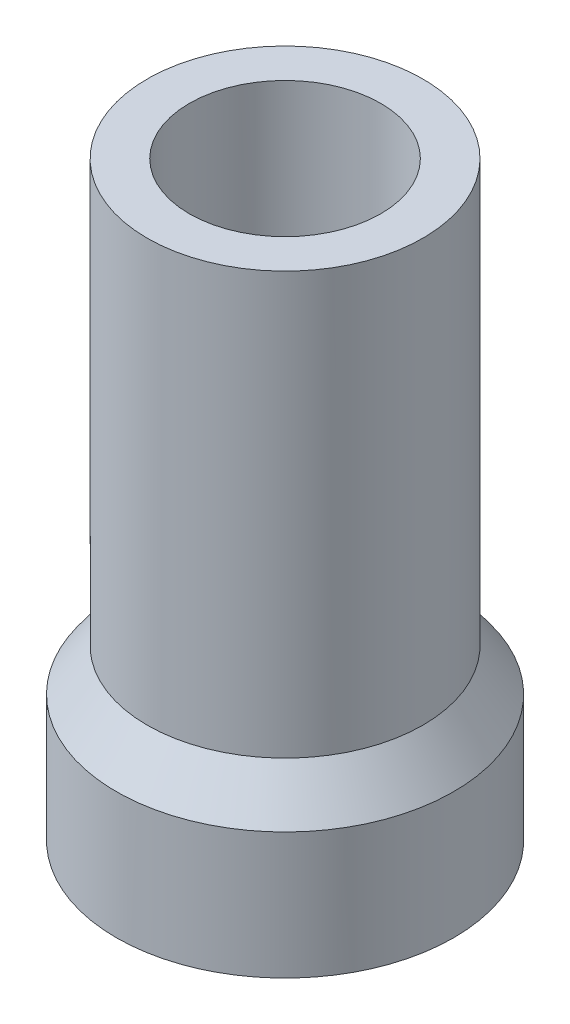
ISO-10303-21;
HEADER;
FILE_DESCRIPTION(('STEP AP214'),'2;1');
FILE_NAME('part.step','',(''),(''),'','','');
FILE_SCHEMA(('AUTOMOTIVE_DESIGN { 1 0 10303 214 1 1 1 1 }'));
ENDSEC;
DATA;
#1=APPLICATION_CONTEXT('core data for automotive mechanical design processes');
#2=APPLICATION_PROTOCOL_DEFINITION('international standard','automotive_design',2000,#1);
#3=PRODUCT_CONTEXT('',#1,'mechanical');
#4=PRODUCT('Part','Part','',(#3));
#5=PRODUCT_RELATED_PRODUCT_CATEGORY('part','',(#4));
#6=PRODUCT_DEFINITION_FORMATION('','',#4);
#7=PRODUCT_DEFINITION_CONTEXT('part definition',#1,'design');
#8=PRODUCT_DEFINITION('design','',#6,#7);
#9=PRODUCT_DEFINITION_SHAPE('','',#8);
#10=(LENGTH_UNIT() NAMED_UNIT(*) SI_UNIT(.MILLI.,.METRE.));
#11=(NAMED_UNIT(*) PLANE_ANGLE_UNIT() SI_UNIT($,.RADIAN.));
#12=(NAMED_UNIT(*) SI_UNIT($,.STERADIAN.) SOLID_ANGLE_UNIT());
#13=UNCERTAINTY_MEASURE_WITH_UNIT(LENGTH_MEASURE(1.E-05),#10,'distance_accuracy_value','');
#14=(GEOMETRIC_REPRESENTATION_CONTEXT(3) GLOBAL_UNCERTAINTY_ASSIGNED_CONTEXT((#13)) GLOBAL_UNIT_ASSIGNED_CONTEXT((#10,
#11,#12)) REPRESENTATION_CONTEXT('',''));
#15=CARTESIAN_POINT('',(0.,0.,0.));
#16=DIRECTION('',(0.,0.,1.));
#17=DIRECTION('',(1.,0.,0.));
#18=AXIS2_PLACEMENT_3D('',#15,#16,#17);
#19=CARTESIAN_POINT('',(0.,3.,0.));
#20=DIRECTION('',(0.,1.,0.));
#21=DIRECTION('',(0.,0.,1.));
#22=AXIS2_PLACEMENT_3D('',#19,#20,#21);
#23=PLANE('',#22);
#24=CARTESIAN_POINT('',(0.,3.,0.));
#25=DIRECTION('',(0.,1.,0.));
#26=DIRECTION('',(1.,0.,0.));
#27=AXIS2_PLACEMENT_3D('',#24,#25,#26);
#28=CIRCLE('',#27,3.);
#29=CARTESIAN_POINT('',(3.,3.,0.));
#30=VERTEX_POINT('',#29);
#31=EDGE_CURVE('E59',#30,#30,#28,.T.);
#32=ORIENTED_EDGE('',*,*,#31,.F.);
#33=EDGE_LOOP('',(#32));
#34=FACE_BOUND('',#33,.T.);
#35=CARTESIAN_POINT('',(0.,3.,0.));
#36=DIRECTION('',(0.,1.,0.));
#37=DIRECTION('',(0.,0.,1.));
#38=AXIS2_PLACEMENT_3D('',#35,#36,#37);
#39=CIRCLE('',#38,3.00913132624826);
#40=CARTESIAN_POINT('',(0.,3.,3.00913132624826));
#41=VERTEX_POINT('',#40);
#42=EDGE_CURVE('E114',#41,#41,#39,.T.);
#43=ORIENTED_EDGE('',*,*,#42,.T.);
#44=EDGE_LOOP('',(#43));
#45=FACE_BOUND('',#44,.T.);
#46=ADVANCED_FACE('F45',(#34,#45),#23,.T.);
#47=CARTESIAN_POINT('',(0.,0.,0.));
#48=DIRECTION('',(0.,1.,0.));
#49=DIRECTION('',(0.,0.,1.));
#50=AXIS2_PLACEMENT_3D('',#47,#48,#49);
#51=PLANE('',#50);
#52=CARTESIAN_POINT('',(0.,0.,0.));
#53=DIRECTION('',(0.,1.,0.));
#54=DIRECTION('',(0.,0.,1.));
#55=AXIS2_PLACEMENT_3D('',#52,#53,#54);
#56=CIRCLE('',#55,4.);
#57=CARTESIAN_POINT('',(0.,0.,4.));
#58=VERTEX_POINT('',#57);
#59=EDGE_CURVE('E54',#58,#58,#56,.T.);
#60=ORIENTED_EDGE('',*,*,#59,.F.);
#61=EDGE_LOOP('',(#60));
#62=FACE_BOUND('',#61,.T.);
#63=CARTESIAN_POINT('',(0.,0.,0.));
#64=DIRECTION('',(0.,1.,0.));
#65=DIRECTION('',(1.,0.,0.));
#66=AXIS2_PLACEMENT_3D('',#63,#64,#65);
#67=CIRCLE('',#66,3.);
#68=CARTESIAN_POINT('',(3.,0.,0.));
#69=VERTEX_POINT('',#68);
#70=EDGE_CURVE('E110',#69,#69,#67,.T.);
#71=ORIENTED_EDGE('',*,*,#70,.T.);
#72=EDGE_LOOP('',(#71));
#73=FACE_BOUND('',#72,.T.);
#74=ADVANCED_FACE('F145',(#62,#73),#51,.F.);
#75=CARTESIAN_POINT('',(0.,3.,0.));
#76=DIRECTION('',(0.,-1.,0.));
#77=DIRECTION('',(0.,0.,-1.));
#78=AXIS2_PLACEMENT_3D('',#75,#76,#77);
#79=CYLINDRICAL_SURFACE('',#78,4.);
#80=CARTESIAN_POINT('',(0.,3.,0.));
#81=DIRECTION('',(0.,-1.,0.));
#82=DIRECTION('',(0.,0.,-1.));
#83=AXIS2_PLACEMENT_3D('',#80,#81,#82);
#84=CIRCLE('',#83,4.);
#85=CARTESIAN_POINT('',(0.,3.,-4.));
#86=VERTEX_POINT('',#85);
#87=EDGE_CURVE('E11',#86,#86,#84,.F.);
#88=ORIENTED_EDGE('',*,*,#87,.F.);
#89=EDGE_LOOP('',(#88));
#90=FACE_BOUND('',#89,.T.);
#91=ORIENTED_EDGE('',*,*,#59,.T.);
#92=EDGE_LOOP('',(#91));
#93=FACE_BOUND('',#92,.T.);
#94=ADVANCED_FACE('F47',(#90,#93),#79,.T.);
#95=CARTESIAN_POINT('',(0.,3.,0.));
#96=DIRECTION('',(0.,-1.,0.));
#97=DIRECTION('',(0.,0.,-1.));
#98=AXIS2_PLACEMENT_3D('',#95,#96,#97);
#99=CYLINDRICAL_SURFACE('',#98,3.);
#100=ORIENTED_EDGE('',*,*,#31,.T.);
#101=EDGE_LOOP('',(#100));
#102=FACE_BOUND('',#101,.T.);
#103=ORIENTED_EDGE('',*,*,#70,.F.);
#104=EDGE_LOOP('',(#103));
#105=FACE_BOUND('',#104,.T.);
#106=ADVANCED_FACE('F94',(#102,#105),#99,.F.);
#107=CARTESIAN_POINT('',(0.,4.,0.));
#108=DIRECTION('',(0.,-1.,0.));
#109=DIRECTION('',(0.,0.,-1.));
#110=AXIS2_PLACEMENT_3D('',#107,#108,#109);
#111=CONICAL_SURFACE('',#110,3.26918204149549,0.631111151390743);
#112=ORIENTED_EDGE('',*,*,#87,.T.);
#113=EDGE_LOOP('',(#112));
#114=FACE_BOUND('',#113,.T.);
#115=CARTESIAN_POINT('',(0.,4.,0.));
#116=DIRECTION('',(0.,1.,0.));
#117=DIRECTION('',(0.,0.,1.));
#118=AXIS2_PLACEMENT_3D('',#115,#116,#117);
#119=CIRCLE('',#118,3.26918204149549);
#120=CARTESIAN_POINT('',(0.,4.,3.26918204149549));
#121=VERTEX_POINT('',#120);
#122=EDGE_CURVE('E49',#121,#121,#119,.T.);
#123=ORIENTED_EDGE('',*,*,#122,.F.);
#124=EDGE_LOOP('',(#123));
#125=FACE_BOUND('',#124,.T.);
#126=ADVANCED_FACE('F86',(#114,#125),#111,.T.);
#127=CARTESIAN_POINT('',(0.,3.52796621203904,0.));
#128=DIRECTION('',(0.,-1.,0.));
#129=DIRECTION('',(0.,0.,-1.));
#130=AXIS2_PLACEMENT_3D('',#127,#128,#129);
#131=CONICAL_SURFACE('',#130,2.62328413700653,0.631111151390743);
#132=ORIENTED_EDGE('',*,*,#42,.F.);
#133=EDGE_LOOP('',(#132));
#134=FACE_BOUND('',#133,.T.);
#135=CARTESIAN_POINT('',(0.,4.,0.));
#136=DIRECTION('',(0.,1.,0.));
#137=DIRECTION('',(0.,0.,1.));
#138=AXIS2_PLACEMENT_3D('',#135,#136,#137);
#139=CIRCLE('',#138,2.27831336774375);
#140=CARTESIAN_POINT('',(0.,4.,2.27831336774375));
#141=VERTEX_POINT('',#140);
#142=EDGE_CURVE('E69',#141,#141,#139,.T.);
#143=ORIENTED_EDGE('',*,*,#142,.T.);
#144=EDGE_LOOP('',(#143));
#145=FACE_BOUND('',#144,.T.);
#146=ADVANCED_FACE('F75',(#134,#145),#131,.F.);
#147=CARTESIAN_POINT('',(0.,14.,0.));
#148=DIRECTION('',(0.,1.,0.));
#149=DIRECTION('',(0.,0.,1.));
#150=AXIS2_PLACEMENT_3D('',#147,#148,#149);
#151=PLANE('',#150);
#152=CARTESIAN_POINT('',(0.,14.,0.));
#153=DIRECTION('',(0.,1.,0.));
#154=DIRECTION('',(0.,0.,1.));
#155=AXIS2_PLACEMENT_3D('',#152,#153,#154);
#156=CIRCLE('',#155,3.26918204149549);
#157=CARTESIAN_POINT('',(0.,14.,3.26918204149549));
#158=VERTEX_POINT('',#157);
#159=EDGE_CURVE('E117',#158,#158,#156,.T.);
#160=ORIENTED_EDGE('',*,*,#159,.T.);
#161=EDGE_LOOP('',(#160));
#162=FACE_BOUND('',#161,.T.);
#163=CARTESIAN_POINT('',(0.,14.,0.));
#164=DIRECTION('',(0.,1.,0.));
#165=DIRECTION('',(1.,0.,0.));
#166=AXIS2_PLACEMENT_3D('',#163,#164,#165);
#167=CIRCLE('',#166,2.26918204149549);
#168=CARTESIAN_POINT('',(2.26918204149549,14.,0.));
#169=VERTEX_POINT('',#168);
#170=EDGE_CURVE('E121',#169,#169,#167,.T.);
#171=ORIENTED_EDGE('',*,*,#170,.F.);
#172=EDGE_LOOP('',(#171));
#173=FACE_BOUND('',#172,.T.);
#174=ADVANCED_FACE('F85',(#162,#173),#151,.T.);
#175=CARTESIAN_POINT('',(0.,14.,0.));
#176=DIRECTION('',(0.,-1.,0.));
#177=DIRECTION('',(0.,0.,-1.));
#178=AXIS2_PLACEMENT_3D('',#175,#176,#177);
#179=CYLINDRICAL_SURFACE('',#178,3.26918204149549);
#180=ORIENTED_EDGE('',*,*,#159,.F.);
#181=EDGE_LOOP('',(#180));
#182=FACE_BOUND('',#181,.T.);
#183=ORIENTED_EDGE('',*,*,#122,.T.);
#184=EDGE_LOOP('',(#183));
#185=FACE_BOUND('',#184,.T.);
#186=ADVANCED_FACE('F88',(#182,#185),#179,.T.);
#187=CARTESIAN_POINT('',(0.,14.,0.));
#188=DIRECTION('',(0.,-1.,0.));
#189=DIRECTION('',(0.,0.,-1.));
#190=AXIS2_PLACEMENT_3D('',#187,#188,#189);
#191=CYLINDRICAL_SURFACE('',#190,2.26918204149549);
#192=ORIENTED_EDGE('',*,*,#170,.T.);
#193=EDGE_LOOP('',(#192));
#194=FACE_BOUND('',#193,.T.);
#195=ORIENTED_EDGE('',*,*,#142,.F.);
#196=EDGE_LOOP('',(#195));
#197=FACE_BOUND('',#196,.T.);
#198=ADVANCED_FACE('F128',(#194,#197),#191,.F.);
#199=CLOSED_SHELL('',(#46,#74,#94,#106,#126,#146,#174,#186,#198));
#200=MANIFOLD_SOLID_BREP('B2',#199);
#201=ADVANCED_BREP_SHAPE_REPRESENTATION('',(#18,#200),#14);
#202=SHAPE_DEFINITION_REPRESENTATION(#9,#201);
ENDSEC;
END-ISO-10303-21;
